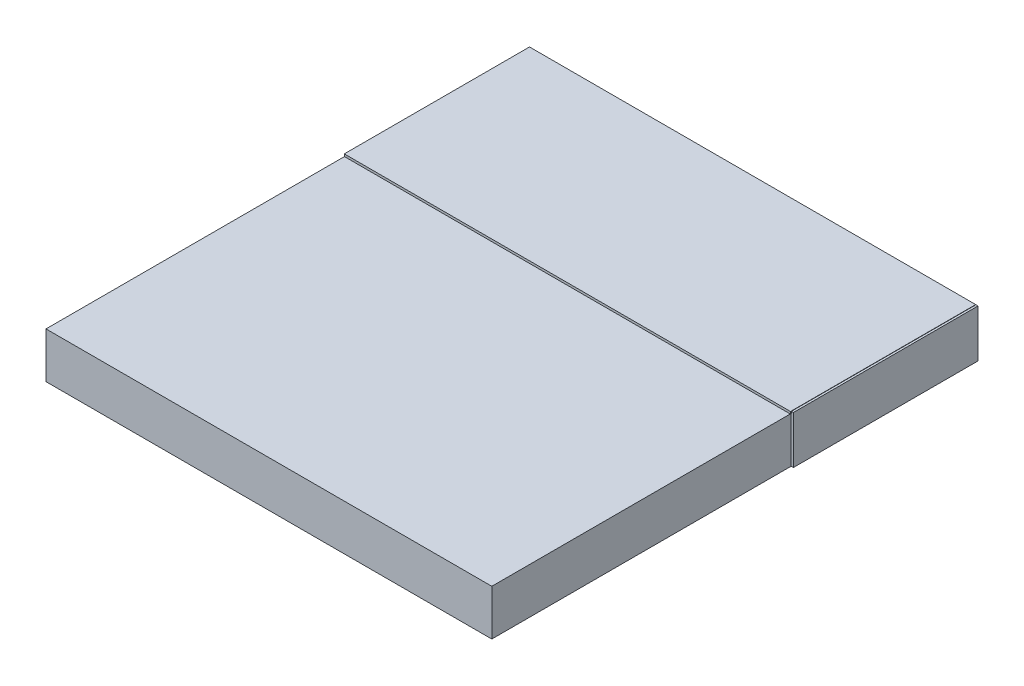
ISO-10303-21;
HEADER;
FILE_DESCRIPTION(('STEP AP214'),'2;1');
FILE_NAME('part.step','',(''),(''),'','','');
FILE_SCHEMA(('AUTOMOTIVE_DESIGN { 1 0 10303 214 1 1 1 1 }'));
ENDSEC;
DATA;
#1=APPLICATION_CONTEXT('core data for automotive mechanical design processes');
#2=APPLICATION_PROTOCOL_DEFINITION('international standard','automotive_design',2000,#1);
#3=PRODUCT_CONTEXT('',#1,'mechanical');
#4=PRODUCT('Part','Part','',(#3));
#5=PRODUCT_RELATED_PRODUCT_CATEGORY('part','',(#4));
#6=PRODUCT_DEFINITION_FORMATION('','',#4);
#7=PRODUCT_DEFINITION_CONTEXT('part definition',#1,'design');
#8=PRODUCT_DEFINITION('design','',#6,#7);
#9=PRODUCT_DEFINITION_SHAPE('','',#8);
#10=(LENGTH_UNIT() NAMED_UNIT(*) SI_UNIT(.MILLI.,.METRE.));
#11=(NAMED_UNIT(*) PLANE_ANGLE_UNIT() SI_UNIT($,.RADIAN.));
#12=(NAMED_UNIT(*) SI_UNIT($,.STERADIAN.) SOLID_ANGLE_UNIT());
#13=UNCERTAINTY_MEASURE_WITH_UNIT(LENGTH_MEASURE(1.E-05),#10,'distance_accuracy_value','');
#14=(GEOMETRIC_REPRESENTATION_CONTEXT(3) GLOBAL_UNCERTAINTY_ASSIGNED_CONTEXT((#13)) GLOBAL_UNIT_ASSIGNED_CONTEXT((#10,
#11,#12)) REPRESENTATION_CONTEXT('',''));
#15=CARTESIAN_POINT('',(0.,0.,0.));
#16=DIRECTION('',(0.,0.,1.));
#17=DIRECTION('',(1.,0.,0.));
#18=AXIS2_PLACEMENT_3D('',#15,#16,#17);
#19=CARTESIAN_POINT('',(9.75142341945912,2.,-10.585819682376));
#20=DIRECTION('',(-1.,0.,0.));
#21=DIRECTION('',(0.,0.,1.));
#22=AXIS2_PLACEMENT_3D('',#19,#20,#21);
#23=PLANE('',#22);
#24=DIRECTION('',(0.,1.,0.));
#25=VECTOR('',#24,1.);
#26=CARTESIAN_POINT('',(9.75142341945912,2.08582419367076,-10.5843187868118));
#27=LINE('',#26,#25);
#28=CARTESIAN_POINT('',(9.75142341945912,0.00118639121637898,-10.5843187868118));
#29=VERTEX_POINT('',#28);
#30=CARTESIAN_POINT('',(9.75142341945912,2.,-10.5843187868118));
#31=VERTEX_POINT('',#30);
#32=EDGE_CURVE('E49',#29,#31,#27,.T.);
#33=ORIENTED_EDGE('',*,*,#32,.F.);
#34=DIRECTION('',(0.,0.,-1.));
#35=VECTOR('',#34,1.);
#36=CARTESIAN_POINT('',(9.75142341945912,0.00118639121637898,-2.50965334078046));
#37=LINE('',#36,#35);
#38=CARTESIAN_POINT('',(9.75142341945912,0.00118639121637898,-2.50965334078046));
#39=VERTEX_POINT('',#38);
#40=EDGE_CURVE('E53',#39,#29,#37,.T.);
#41=ORIENTED_EDGE('',*,*,#40,.F.);
#42=DIRECTION('',(0.,-1.,0.));
#43=VECTOR('',#42,1.);
#44=CARTESIAN_POINT('',(9.75142341945912,2.08582419367076,-2.50965334078046));
#45=LINE('',#44,#43);
#46=CARTESIAN_POINT('',(9.75142341945912,2.,-2.50965334078046));
#47=VERTEX_POINT('',#46);
#48=EDGE_CURVE('E301',#47,#39,#45,.T.);
#49=ORIENTED_EDGE('',*,*,#48,.F.);
#50=DIRECTION('',(0.,0.,-1.));
#51=VECTOR('',#50,1.);
#52=CARTESIAN_POINT('',(9.75142341945912,2.,-10.585819682376));
#53=LINE('',#52,#51);
#54=CARTESIAN_POINT('',(9.75142341945912,2.,-2.47035930635775));
#55=VERTEX_POINT('',#54);
#56=EDGE_CURVE('E221',#55,#47,#53,.T.);
#57=ORIENTED_EDGE('',*,*,#56,.F.);
#58=CARTESIAN_POINT('',(9.75142341945912,2.,10.585819682376));
#59=VERTEX_POINT('',#58);
#60=EDGE_CURVE('E217',#59,#55,#53,.T.);
#61=ORIENTED_EDGE('',*,*,#60,.F.);
#62=DIRECTION('',(0.,-1.,0.));
#63=VECTOR('',#62,1.);
#64=CARTESIAN_POINT('',(9.75142341945912,2.,10.585819682376));
#65=LINE('',#64,#63);
#66=CARTESIAN_POINT('',(9.75142341945912,0.,10.585819682376));
#67=VERTEX_POINT('',#66);
#68=EDGE_CURVE('E230',#59,#67,#65,.T.);
#69=ORIENTED_EDGE('',*,*,#68,.T.);
#70=DIRECTION('',(0.,0.,-1.));
#71=VECTOR('',#70,1.);
#72=CARTESIAN_POINT('',(9.75142341945912,0.,-10.585819682376));
#73=LINE('',#72,#71);
#74=CARTESIAN_POINT('',(9.75142341945912,0.,-10.585819682376));
#75=VERTEX_POINT('',#74);
#76=EDGE_CURVE('E216',#67,#75,#73,.T.);
#77=ORIENTED_EDGE('',*,*,#76,.T.);
#78=DIRECTION('',(0.,-1.,0.));
#79=VECTOR('',#78,1.);
#80=CARTESIAN_POINT('',(9.75142341945912,2.,-10.585819682376));
#81=LINE('',#80,#79);
#82=CARTESIAN_POINT('',(9.75142341945912,2.,-10.585819682376));
#83=VERTEX_POINT('',#82);
#84=EDGE_CURVE('E247',#83,#75,#81,.T.);
#85=ORIENTED_EDGE('',*,*,#84,.F.);
#86=EDGE_CURVE('E222',#31,#83,#53,.T.);
#87=ORIENTED_EDGE('',*,*,#86,.F.);
#88=EDGE_LOOP('',(#33,#41,#49,#57,#61,#69,#77,#85,#87));
#89=FACE_BOUND('',#88,.T.);
#90=ADVANCED_FACE('F35',(#89),#23,.F.);
#91=CARTESIAN_POINT('',(0.,2.,0.));
#92=DIRECTION('',(0.,1.,0.));
#93=DIRECTION('',(0.,0.,1.));
#94=AXIS2_PLACEMENT_3D('',#91,#92,#93);
#95=PLANE('',#94);
#96=DIRECTION('',(-1.,0.,0.));
#97=VECTOR('',#96,1.);
#98=CARTESIAN_POINT('',(0.,2.,-2.50965334078046));
#99=LINE('',#98,#97);
#100=CARTESIAN_POINT('',(9.76265633079265,2.,-2.50965334078046));
#101=VERTEX_POINT('',#100);
#102=EDGE_CURVE('E174',#101,#47,#99,.T.);
#103=ORIENTED_EDGE('',*,*,#102,.F.);
#104=DIRECTION('',(0.,0.,-1.));
#105=VECTOR('',#104,1.);
#106=CARTESIAN_POINT('',(9.76265633079265,2.,-10.5724784344829));
#107=LINE('',#106,#105);
#108=CARTESIAN_POINT('',(9.76265633079265,2.,-2.47035930635775));
#109=VERTEX_POINT('',#108);
#110=EDGE_CURVE('E182',#109,#101,#107,.T.);
#111=ORIENTED_EDGE('',*,*,#110,.F.);
#112=DIRECTION('',(1.,0.,0.));
#113=VECTOR('',#112,1.);
#114=CARTESIAN_POINT('',(-9.75776628706626,2.,-2.47035930635775));
#115=LINE('',#114,#113);
#116=EDGE_CURVE('E201',#55,#109,#115,.T.);
#117=ORIENTED_EDGE('',*,*,#116,.F.);
#118=ORIENTED_EDGE('',*,*,#56,.T.);
#119=EDGE_LOOP('',(#103,#111,#117,#118));
#120=FACE_BOUND('',#119,.T.);
#121=ADVANCED_FACE('F297',(#120),#95,.F.);
#122=CARTESIAN_POINT('',(9.76265633079265,2.1,-10.5724784344829));
#123=DIRECTION('',(-1.,0.,0.));
#124=DIRECTION('',(0.,0.,1.));
#125=AXIS2_PLACEMENT_3D('',#122,#123,#124);
#126=PLANE('',#125);
#127=DIRECTION('',(0.,0.,1.));
#128=VECTOR('',#127,1.);
#129=CARTESIAN_POINT('',(9.76265633079265,2.08582419367076,-10.5724784344829));
#130=LINE('',#129,#128);
#131=CARTESIAN_POINT('',(9.76265633079265,2.08582419367076,-10.5724784344829));
#132=VERTEX_POINT('',#131);
#133=CARTESIAN_POINT('',(9.76265633079265,2.08582419367076,-2.50965334078046));
#134=VERTEX_POINT('',#133);
#135=EDGE_CURVE('E172',#132,#134,#130,.T.);
#136=ORIENTED_EDGE('',*,*,#135,.F.);
#137=DIRECTION('',(0.,-1.,0.));
#138=VECTOR('',#137,1.);
#139=CARTESIAN_POINT('',(9.76265633079265,2.1,-10.5724784344829));
#140=LINE('',#139,#138);
#141=CARTESIAN_POINT('',(9.76265633079265,2.1,-10.5724784344829));
#142=VERTEX_POINT('',#141);
#143=EDGE_CURVE('E213',#142,#132,#140,.T.);
#144=ORIENTED_EDGE('',*,*,#143,.F.);
#145=DIRECTION('',(0.,0.,-1.));
#146=VECTOR('',#145,1.);
#147=CARTESIAN_POINT('',(9.76265633079265,2.1,-10.5724784344829));
#148=LINE('',#147,#146);
#149=CARTESIAN_POINT('',(9.76265633079265,2.1,-2.47035930635775));
#150=VERTEX_POINT('',#149);
#151=EDGE_CURVE('E183',#150,#142,#148,.T.);
#152=ORIENTED_EDGE('',*,*,#151,.F.);
#153=DIRECTION('',(0.,-1.,0.));
#154=VECTOR('',#153,1.);
#155=CARTESIAN_POINT('',(9.76265633079265,2.1,-2.47035930635775));
#156=LINE('',#155,#154);
#157=EDGE_CURVE('E193',#150,#109,#156,.T.);
#158=ORIENTED_EDGE('',*,*,#157,.T.);
#159=ORIENTED_EDGE('',*,*,#110,.T.);
#160=DIRECTION('',(0.,-1.,0.));
#161=VECTOR('',#160,1.);
#162=CARTESIAN_POINT('',(9.76265633079265,2.1,-2.50965334078046));
#163=LINE('',#162,#161);
#164=EDGE_CURVE('E11',#134,#101,#163,.T.);
#165=ORIENTED_EDGE('',*,*,#164,.F.);
#166=EDGE_LOOP('',(#136,#144,#152,#158,#159,#165));
#167=FACE_BOUND('',#166,.T.);
#168=ADVANCED_FACE('F296',(#167),#126,.F.);
#169=CARTESIAN_POINT('',(-9.75776628706626,2.1,-10.5724784344829));
#170=DIRECTION('',(0.,0.,1.));
#171=DIRECTION('',(1.,0.,0.));
#172=AXIS2_PLACEMENT_3D('',#169,#170,#171);
#173=PLANE('',#172);
#174=DIRECTION('',(1.,0.,0.));
#175=VECTOR('',#174,1.);
#176=CARTESIAN_POINT('',(-9.75776628706626,2.08582419367076,-10.5724784344829));
#177=LINE('',#176,#175);
#178=CARTESIAN_POINT('',(9.75142341945912,2.08582419367076,-10.5724784344829));
#179=VERTEX_POINT('',#178);
#180=EDGE_CURVE('E42',#179,#132,#177,.T.);
#181=ORIENTED_EDGE('',*,*,#180,.F.);
#182=DIRECTION('',(0.,1.,0.));
#183=VECTOR('',#182,1.);
#184=CARTESIAN_POINT('',(9.75142341945912,2.1,-10.5724784344829));
#185=LINE('',#184,#183);
#186=CARTESIAN_POINT('',(9.75142341945912,2.,-10.5724784344829));
#187=VERTEX_POINT('',#186);
#188=EDGE_CURVE('E250',#187,#179,#185,.T.);
#189=ORIENTED_EDGE('',*,*,#188,.F.);
#190=DIRECTION('',(-1.,0.,0.));
#191=VECTOR('',#190,1.);
#192=CARTESIAN_POINT('',(-9.75776628706626,2.,-10.5724784344829));
#193=LINE('',#192,#191);
#194=CARTESIAN_POINT('',(-9.75142341945912,2.,-10.5724784344829));
#195=VERTEX_POINT('',#194);
#196=EDGE_CURVE('E199',#187,#195,#193,.T.);
#197=ORIENTED_EDGE('',*,*,#196,.T.);
#198=CARTESIAN_POINT('',(-9.75776628706626,2.,-10.5724784344829));
#199=VERTEX_POINT('',#198);
#200=EDGE_CURVE('E196',#195,#199,#193,.T.);
#201=ORIENTED_EDGE('',*,*,#200,.T.);
#202=DIRECTION('',(0.,-1.,0.));
#203=VECTOR('',#202,1.);
#204=CARTESIAN_POINT('',(-9.75776628706626,2.1,-10.5724784344829));
#205=LINE('',#204,#203);
#206=CARTESIAN_POINT('',(-9.75776628706626,2.1,-10.5724784344829));
#207=VERTEX_POINT('',#206);
#208=EDGE_CURVE('E210',#207,#199,#205,.T.);
#209=ORIENTED_EDGE('',*,*,#208,.F.);
#210=DIRECTION('',(-1.,0.,0.));
#211=VECTOR('',#210,1.);
#212=CARTESIAN_POINT('',(-9.75776628706626,2.1,-10.5724784344829));
#213=LINE('',#212,#211);
#214=EDGE_CURVE('E186',#142,#207,#213,.T.);
#215=ORIENTED_EDGE('',*,*,#214,.F.);
#216=ORIENTED_EDGE('',*,*,#143,.T.);
#217=EDGE_LOOP('',(#181,#189,#197,#201,#209,#215,#216));
#218=FACE_BOUND('',#217,.T.);
#219=ADVANCED_FACE('F254',(#218),#173,.F.);
#220=CARTESIAN_POINT('',(0.,2.,0.));
#221=DIRECTION('',(0.,1.,0.));
#222=DIRECTION('',(0.,0.,1.));
#223=AXIS2_PLACEMENT_3D('',#220,#221,#222);
#224=PLANE('',#223);
#225=CARTESIAN_POINT('',(-9.75142341945912,2.,-2.47035930635775));
#226=VERTEX_POINT('',#225);
#227=EDGE_CURVE('E204',#226,#55,#115,.T.);
#228=ORIENTED_EDGE('',*,*,#227,.F.);
#229=DIRECTION('',(0.,0.,1.));
#230=VECTOR('',#229,1.);
#231=CARTESIAN_POINT('',(-9.75142341945912,2.,-10.585819682376));
#232=LINE('',#231,#230);
#233=CARTESIAN_POINT('',(-9.75142341945912,2.,10.585819682376));
#234=VERTEX_POINT('',#233);
#235=EDGE_CURVE('E224',#226,#234,#232,.T.);
#236=ORIENTED_EDGE('',*,*,#235,.T.);
#237=DIRECTION('',(1.,0.,0.));
#238=VECTOR('',#237,1.);
#239=CARTESIAN_POINT('',(-9.75142341945912,2.,10.585819682376));
#240=LINE('',#239,#238);
#241=EDGE_CURVE('E227',#234,#59,#240,.T.);
#242=ORIENTED_EDGE('',*,*,#241,.T.);
#243=ORIENTED_EDGE('',*,*,#60,.T.);
#244=EDGE_LOOP('',(#228,#236,#242,#243));
#245=FACE_BOUND('',#244,.T.);
#246=ADVANCED_FACE('F401',(#245),#224,.T.);
#247=CARTESIAN_POINT('',(-9.75142341945912,2.,-10.585819682376));
#248=DIRECTION('',(0.,0.,1.));
#249=DIRECTION('',(1.,0.,0.));
#250=AXIS2_PLACEMENT_3D('',#247,#248,#249);
#251=PLANE('',#250);
#252=DIRECTION('',(-1.,0.,0.));
#253=VECTOR('',#252,1.);
#254=CARTESIAN_POINT('',(-9.75142341945912,0.,-10.585819682376));
#255=LINE('',#254,#253);
#256=CARTESIAN_POINT('',(-9.75142341945912,0.,-10.585819682376));
#257=VERTEX_POINT('',#256);
#258=EDGE_CURVE('E233',#75,#257,#255,.T.);
#259=ORIENTED_EDGE('',*,*,#258,.T.);
#260=DIRECTION('',(0.,-1.,0.));
#261=VECTOR('',#260,1.);
#262=CARTESIAN_POINT('',(-9.75142341945912,2.,-10.585819682376));
#263=LINE('',#262,#261);
#264=CARTESIAN_POINT('',(-9.75142341945912,2.,-10.585819682376));
#265=VERTEX_POINT('',#264);
#266=EDGE_CURVE('E244',#265,#257,#263,.T.);
#267=ORIENTED_EDGE('',*,*,#266,.F.);
#268=DIRECTION('',(-1.,0.,0.));
#269=VECTOR('',#268,1.);
#270=CARTESIAN_POINT('',(-9.75142341945912,2.,-10.585819682376));
#271=LINE('',#270,#269);
#272=EDGE_CURVE('E220',#83,#265,#271,.T.);
#273=ORIENTED_EDGE('',*,*,#272,.F.);
#274=ORIENTED_EDGE('',*,*,#84,.T.);
#275=EDGE_LOOP('',(#259,#267,#273,#274));
#276=FACE_BOUND('',#275,.T.);
#277=ADVANCED_FACE('F270',(#276),#251,.F.);
#278=CARTESIAN_POINT('',(-9.75142341945912,2.,-10.585819682376));
#279=DIRECTION('',(1.,0.,0.));
#280=DIRECTION('',(0.,0.,-1.));
#281=AXIS2_PLACEMENT_3D('',#278,#279,#280);
#282=PLANE('',#281);
#283=DIRECTION('',(0.,0.,1.));
#284=VECTOR('',#283,1.);
#285=CARTESIAN_POINT('',(-9.75142341945912,0.,-10.585819682376));
#286=LINE('',#285,#284);
#287=CARTESIAN_POINT('',(-9.75142341945912,0.,10.585819682376));
#288=VERTEX_POINT('',#287);
#289=EDGE_CURVE('E235',#257,#288,#286,.T.);
#290=ORIENTED_EDGE('',*,*,#289,.T.);
#291=DIRECTION('',(0.,-1.,0.));
#292=VECTOR('',#291,1.);
#293=CARTESIAN_POINT('',(-9.75142341945912,2.,10.585819682376));
#294=LINE('',#293,#292);
#295=EDGE_CURVE('E241',#234,#288,#294,.T.);
#296=ORIENTED_EDGE('',*,*,#295,.F.);
#297=ORIENTED_EDGE('',*,*,#235,.F.);
#298=EDGE_CURVE('E228',#195,#226,#232,.T.);
#299=ORIENTED_EDGE('',*,*,#298,.F.);
#300=EDGE_CURVE('E225',#265,#195,#232,.T.);
#301=ORIENTED_EDGE('',*,*,#300,.F.);
#302=ORIENTED_EDGE('',*,*,#266,.T.);
#303=EDGE_LOOP('',(#290,#296,#297,#299,#301,#302));
#304=FACE_BOUND('',#303,.T.);
#305=ADVANCED_FACE('F280',(#304),#282,.F.);
#306=CARTESIAN_POINT('',(-9.75142341945912,2.,10.585819682376));
#307=DIRECTION('',(0.,0.,-1.));
#308=DIRECTION('',(-1.,0.,0.));
#309=AXIS2_PLACEMENT_3D('',#306,#307,#308);
#310=PLANE('',#309);
#311=DIRECTION('',(1.,0.,0.));
#312=VECTOR('',#311,1.);
#313=CARTESIAN_POINT('',(-9.75142341945912,0.,10.585819682376));
#314=LINE('',#313,#312);
#315=EDGE_CURVE('E237',#288,#67,#314,.T.);
#316=ORIENTED_EDGE('',*,*,#315,.T.);
#317=ORIENTED_EDGE('',*,*,#68,.F.);
#318=ORIENTED_EDGE('',*,*,#241,.F.);
#319=ORIENTED_EDGE('',*,*,#295,.T.);
#320=EDGE_LOOP('',(#316,#317,#318,#319));
#321=FACE_BOUND('',#320,.T.);
#322=ADVANCED_FACE('F399',(#321),#310,.F.);
#323=ORIENTED_EDGE('',*,*,#196,.F.);
#324=EDGE_CURVE('E262',#187,#31,#53,.T.);
#325=ORIENTED_EDGE('',*,*,#324,.T.);
#326=ORIENTED_EDGE('',*,*,#86,.T.);
#327=ORIENTED_EDGE('',*,*,#272,.T.);
#328=ORIENTED_EDGE('',*,*,#300,.T.);
#329=EDGE_LOOP('',(#323,#325,#326,#327,#328));
#330=FACE_BOUND('',#329,.T.);
#331=ADVANCED_FACE('F266',(#330),#224,.T.);
#332=CARTESIAN_POINT('',(0.,0.,0.));
#333=DIRECTION('',(0.,1.,0.));
#334=DIRECTION('',(0.,0.,1.));
#335=AXIS2_PLACEMENT_3D('',#332,#333,#334);
#336=PLANE('',#335);
#337=ORIENTED_EDGE('',*,*,#76,.F.);
#338=ORIENTED_EDGE('',*,*,#315,.F.);
#339=ORIENTED_EDGE('',*,*,#289,.F.);
#340=ORIENTED_EDGE('',*,*,#258,.F.);
#341=EDGE_LOOP('',(#337,#338,#339,#340));
#342=FACE_BOUND('',#341,.T.);
#343=ADVANCED_FACE('F277',(#342),#336,.F.);
#344=ORIENTED_EDGE('',*,*,#200,.F.);
#345=ORIENTED_EDGE('',*,*,#298,.T.);
#346=CARTESIAN_POINT('',(-9.75776628706626,2.,-2.47035930635775));
#347=VERTEX_POINT('',#346);
#348=EDGE_CURVE('E187',#347,#226,#115,.T.);
#349=ORIENTED_EDGE('',*,*,#348,.F.);
#350=DIRECTION('',(0.,0.,1.));
#351=VECTOR('',#350,1.);
#352=CARTESIAN_POINT('',(-9.75776628706626,2.,-10.5724784344829));
#353=LINE('',#352,#351);
#354=EDGE_CURVE('E198',#199,#347,#353,.T.);
#355=ORIENTED_EDGE('',*,*,#354,.F.);
#356=EDGE_LOOP('',(#344,#345,#349,#355));
#357=FACE_BOUND('',#356,.T.);
#358=ADVANCED_FACE('F328',(#357),#95,.F.);
#359=CARTESIAN_POINT('',(-9.75776628706626,2.1,-10.5724784344829));
#360=DIRECTION('',(1.,0.,0.));
#361=DIRECTION('',(0.,0.,-1.));
#362=AXIS2_PLACEMENT_3D('',#359,#360,#361);
#363=PLANE('',#362);
#364=ORIENTED_EDGE('',*,*,#354,.T.);
#365=DIRECTION('',(0.,-1.,0.));
#366=VECTOR('',#365,1.);
#367=CARTESIAN_POINT('',(-9.75776628706626,2.1,-2.47035930635775));
#368=LINE('',#367,#366);
#369=CARTESIAN_POINT('',(-9.75776628706626,2.1,-2.47035930635775));
#370=VERTEX_POINT('',#369);
#371=EDGE_CURVE('E207',#370,#347,#368,.T.);
#372=ORIENTED_EDGE('',*,*,#371,.F.);
#373=DIRECTION('',(0.,0.,1.));
#374=VECTOR('',#373,1.);
#375=CARTESIAN_POINT('',(-9.75776628706626,2.1,-10.5724784344829));
#376=LINE('',#375,#374);
#377=EDGE_CURVE('E189',#207,#370,#376,.T.);
#378=ORIENTED_EDGE('',*,*,#377,.F.);
#379=ORIENTED_EDGE('',*,*,#208,.T.);
#380=EDGE_LOOP('',(#364,#372,#378,#379));
#381=FACE_BOUND('',#380,.T.);
#382=ADVANCED_FACE('F336',(#381),#363,.F.);
#383=CARTESIAN_POINT('',(-9.75776628706626,2.1,-2.47035930635775));
#384=DIRECTION('',(0.,0.,-1.));
#385=DIRECTION('',(-1.,0.,0.));
#386=AXIS2_PLACEMENT_3D('',#383,#384,#385);
#387=PLANE('',#386);
#388=ORIENTED_EDGE('',*,*,#348,.T.);
#389=ORIENTED_EDGE('',*,*,#227,.T.);
#390=ORIENTED_EDGE('',*,*,#116,.T.);
#391=ORIENTED_EDGE('',*,*,#157,.F.);
#392=DIRECTION('',(1.,0.,0.));
#393=VECTOR('',#392,1.);
#394=CARTESIAN_POINT('',(-9.75776628706626,2.1,-2.47035930635775));
#395=LINE('',#394,#393);
#396=EDGE_CURVE('E191',#370,#150,#395,.T.);
#397=ORIENTED_EDGE('',*,*,#396,.F.);
#398=ORIENTED_EDGE('',*,*,#371,.T.);
#399=EDGE_LOOP('',(#388,#389,#390,#391,#397,#398));
#400=FACE_BOUND('',#399,.T.);
#401=ADVANCED_FACE('F290',(#400),#387,.F.);
#402=CARTESIAN_POINT('',(0.,2.1,0.));
#403=DIRECTION('',(0.,1.,0.));
#404=DIRECTION('',(0.,0.,1.));
#405=AXIS2_PLACEMENT_3D('',#402,#403,#404);
#406=PLANE('',#405);
#407=ORIENTED_EDGE('',*,*,#151,.T.);
#408=ORIENTED_EDGE('',*,*,#214,.T.);
#409=ORIENTED_EDGE('',*,*,#377,.T.);
#410=ORIENTED_EDGE('',*,*,#396,.T.);
#411=EDGE_LOOP('',(#407,#408,#409,#410));
#412=FACE_BOUND('',#411,.T.);
#413=ADVANCED_FACE('F351',(#412),#406,.T.);
#414=CARTESIAN_POINT('',(9.85142341945912,2.08582419367076,-2.50965334078046));
#415=DIRECTION('',(0.,0.,-1.));
#416=DIRECTION('',(0.,1.,0.));
#417=AXIS2_PLACEMENT_3D('',#414,#415,#416);
#418=PLANE('',#417);
#419=ORIENTED_EDGE('',*,*,#164,.T.);
#420=ORIENTED_EDGE('',*,*,#102,.T.);
#421=ORIENTED_EDGE('',*,*,#48,.T.);
#422=DIRECTION('',(-1.,0.,0.));
#423=VECTOR('',#422,1.);
#424=CARTESIAN_POINT('',(9.85142341945912,0.00118639121637898,-2.50965334078046));
#425=LINE('',#424,#423);
#426=CARTESIAN_POINT('',(9.85142341945912,0.00118639121637898,-2.50965334078046));
#427=VERTEX_POINT('',#426);
#428=EDGE_CURVE('E176',#427,#39,#425,.T.);
#429=ORIENTED_EDGE('',*,*,#428,.F.);
#430=DIRECTION('',(0.,-1.,0.));
#431=VECTOR('',#430,1.);
#432=CARTESIAN_POINT('',(9.85142341945912,2.08582419367076,-2.50965334078046));
#433=LINE('',#432,#431);
#434=CARTESIAN_POINT('',(9.85142341945912,2.08582419367076,-2.50965334078046));
#435=VERTEX_POINT('',#434);
#436=EDGE_CURVE('E157',#435,#427,#433,.T.);
#437=ORIENTED_EDGE('',*,*,#436,.F.);
#438=DIRECTION('',(-1.,0.,0.));
#439=VECTOR('',#438,1.);
#440=CARTESIAN_POINT('',(9.85142341945912,2.08582419367076,-2.50965334078046));
#441=LINE('',#440,#439);
#442=EDGE_CURVE('E154',#435,#134,#441,.T.);
#443=ORIENTED_EDGE('',*,*,#442,.T.);
#444=EDGE_LOOP('',(#419,#420,#421,#429,#437,#443));
#445=FACE_BOUND('',#444,.T.);
#446=ADVANCED_FACE('F299',(#445),#418,.F.);
#447=CARTESIAN_POINT('',(9.85142341945912,2.08582419367076,-2.50965334078046));
#448=DIRECTION('',(0.,-1.,0.));
#449=DIRECTION('',(0.,0.,-1.));
#450=AXIS2_PLACEMENT_3D('',#447,#448,#449);
#451=PLANE('',#450);
#452=ORIENTED_EDGE('',*,*,#180,.T.);
#453=ORIENTED_EDGE('',*,*,#135,.T.);
#454=ORIENTED_EDGE('',*,*,#442,.F.);
#455=DIRECTION('',(0.,0.,1.));
#456=VECTOR('',#455,1.);
#457=CARTESIAN_POINT('',(9.85142341945912,2.08582419367076,-2.50965334078046));
#458=LINE('',#457,#456);
#459=CARTESIAN_POINT('',(9.85142341945912,2.08582419367076,-10.5843187868118));
#460=VERTEX_POINT('',#459);
#461=EDGE_CURVE('E145',#460,#435,#458,.T.);
#462=ORIENTED_EDGE('',*,*,#461,.F.);
#463=DIRECTION('',(-1.,0.,0.));
#464=VECTOR('',#463,1.);
#465=CARTESIAN_POINT('',(9.85142341945912,2.08582419367076,-10.5843187868118));
#466=LINE('',#465,#464);
#467=CARTESIAN_POINT('',(9.75142341945912,2.08582419367076,-10.5843187868118));
#468=VERTEX_POINT('',#467);
#469=EDGE_CURVE('E151',#460,#468,#466,.T.);
#470=ORIENTED_EDGE('',*,*,#469,.T.);
#471=DIRECTION('',(0.,0.,1.));
#472=VECTOR('',#471,1.);
#473=CARTESIAN_POINT('',(9.75142341945912,2.08582419367076,-2.50965334078046));
#474=LINE('',#473,#472);
#475=EDGE_CURVE('E252',#468,#179,#474,.T.);
#476=ORIENTED_EDGE('',*,*,#475,.T.);
#477=EDGE_LOOP('',(#452,#453,#454,#462,#470,#476));
#478=FACE_BOUND('',#477,.T.);
#479=ADVANCED_FACE('F148',(#478),#451,.F.);
#480=CARTESIAN_POINT('',(9.75142341945912,0.,0.));
#481=DIRECTION('',(1.,0.,0.));
#482=DIRECTION('',(0.,0.,-1.));
#483=AXIS2_PLACEMENT_3D('',#480,#481,#482);
#484=PLANE('',#483);
#485=ORIENTED_EDGE('',*,*,#324,.F.);
#486=ORIENTED_EDGE('',*,*,#188,.T.);
#487=ORIENTED_EDGE('',*,*,#475,.F.);
#488=EDGE_CURVE('E170',#31,#468,#27,.T.);
#489=ORIENTED_EDGE('',*,*,#488,.F.);
#490=EDGE_LOOP('',(#485,#486,#487,#489));
#491=FACE_BOUND('',#490,.T.);
#492=ADVANCED_FACE('F260',(#491),#484,.F.);
#493=CARTESIAN_POINT('',(9.85142341945912,2.08582419367076,-10.5843187868118));
#494=DIRECTION('',(0.,0.,1.));
#495=DIRECTION('',(1.,0.,0.));
#496=AXIS2_PLACEMENT_3D('',#493,#494,#495);
#497=PLANE('',#496);
#498=ORIENTED_EDGE('',*,*,#32,.T.);
#499=ORIENTED_EDGE('',*,*,#488,.T.);
#500=ORIENTED_EDGE('',*,*,#469,.F.);
#501=DIRECTION('',(0.,1.,0.));
#502=VECTOR('',#501,1.);
#503=CARTESIAN_POINT('',(9.85142341945912,2.08582419367076,-10.5843187868118));
#504=LINE('',#503,#502);
#505=CARTESIAN_POINT('',(9.85142341945912,0.00118639121637898,-10.5843187868118));
#506=VERTEX_POINT('',#505);
#507=EDGE_CURVE('E158',#506,#460,#504,.T.);
#508=ORIENTED_EDGE('',*,*,#507,.F.);
#509=DIRECTION('',(-1.,0.,0.));
#510=VECTOR('',#509,1.);
#511=CARTESIAN_POINT('',(9.85142341945912,0.00118639121637898,-10.5843187868118));
#512=LINE('',#511,#510);
#513=EDGE_CURVE('E304',#506,#29,#512,.T.);
#514=ORIENTED_EDGE('',*,*,#513,.T.);
#515=EDGE_LOOP('',(#498,#499,#500,#508,#514));
#516=FACE_BOUND('',#515,.T.);
#517=ADVANCED_FACE('F168',(#516),#497,.F.);
#518=CARTESIAN_POINT('',(9.85142341945912,0.00118639121637898,-2.50965334078046));
#519=DIRECTION('',(0.,1.,0.));
#520=DIRECTION('',(0.,0.,1.));
#521=AXIS2_PLACEMENT_3D('',#518,#519,#520);
#522=PLANE('',#521);
#523=ORIENTED_EDGE('',*,*,#40,.T.);
#524=ORIENTED_EDGE('',*,*,#513,.F.);
#525=DIRECTION('',(0.,0.,-1.));
#526=VECTOR('',#525,1.);
#527=CARTESIAN_POINT('',(9.85142341945912,0.00118639121637898,-2.50965334078046));
#528=LINE('',#527,#526);
#529=EDGE_CURVE('E163',#427,#506,#528,.T.);
#530=ORIENTED_EDGE('',*,*,#529,.F.);
#531=ORIENTED_EDGE('',*,*,#428,.T.);
#532=EDGE_LOOP('',(#523,#524,#530,#531));
#533=FACE_BOUND('',#532,.T.);
#534=ADVANCED_FACE('F312',(#533),#522,.F.);
#535=CARTESIAN_POINT('',(9.85142341945912,0.,0.));
#536=DIRECTION('',(1.,0.,0.));
#537=DIRECTION('',(0.,0.,-1.));
#538=AXIS2_PLACEMENT_3D('',#535,#536,#537);
#539=PLANE('',#538);
#540=ORIENTED_EDGE('',*,*,#507,.T.);
#541=ORIENTED_EDGE('',*,*,#461,.T.);
#542=ORIENTED_EDGE('',*,*,#436,.T.);
#543=ORIENTED_EDGE('',*,*,#529,.T.);
#544=EDGE_LOOP('',(#540,#541,#542,#543));
#545=FACE_BOUND('',#544,.T.);
#546=ADVANCED_FACE('F161',(#545),#539,.T.);
#547=CLOSED_SHELL('',(#90,#121,#168,#219,#246,#277,#305,#322,#331,#343,#358,#382,#401,#413,#446,
#479,#492,#517,#534,#546));
#548=MANIFOLD_SOLID_BREP('B2',#547);
#549=ADVANCED_BREP_SHAPE_REPRESENTATION('',(#18,#548),#14);
#550=SHAPE_DEFINITION_REPRESENTATION(#9,#549);
ENDSEC;
END-ISO-10303-21;
